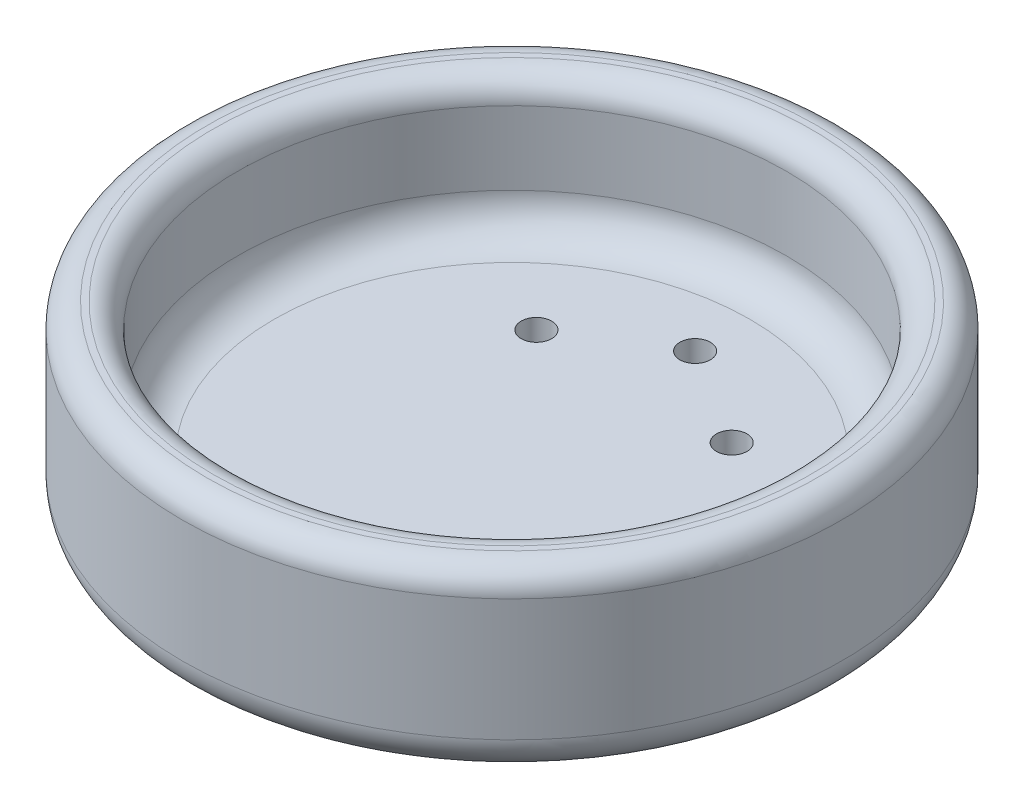
ISO-10303-21;
HEADER;
FILE_DESCRIPTION(('STEP AP214'),'2;1');
FILE_NAME('part.step','',(''),(''),'','','');
FILE_SCHEMA(('AUTOMOTIVE_DESIGN { 1 0 10303 214 1 1 1 1 }'));
ENDSEC;
DATA;
#1=APPLICATION_CONTEXT('core data for automotive mechanical design processes');
#2=APPLICATION_PROTOCOL_DEFINITION('international standard','automotive_design',2000,#1);
#3=PRODUCT_CONTEXT('',#1,'mechanical');
#4=PRODUCT('Part','Part','',(#3));
#5=PRODUCT_RELATED_PRODUCT_CATEGORY('part','',(#4));
#6=PRODUCT_DEFINITION_FORMATION('','',#4);
#7=PRODUCT_DEFINITION_CONTEXT('part definition',#1,'design');
#8=PRODUCT_DEFINITION('design','',#6,#7);
#9=PRODUCT_DEFINITION_SHAPE('','',#8);
#10=(LENGTH_UNIT() NAMED_UNIT(*) SI_UNIT(.MILLI.,.METRE.));
#11=(NAMED_UNIT(*) PLANE_ANGLE_UNIT() SI_UNIT($,.RADIAN.));
#12=(NAMED_UNIT(*) SI_UNIT($,.STERADIAN.) SOLID_ANGLE_UNIT());
#13=UNCERTAINTY_MEASURE_WITH_UNIT(LENGTH_MEASURE(1.E-05),#10,'distance_accuracy_value','');
#14=(GEOMETRIC_REPRESENTATION_CONTEXT(3) GLOBAL_UNCERTAINTY_ASSIGNED_CONTEXT((#13)) GLOBAL_UNIT_ASSIGNED_CONTEXT((#10,
#11,#12)) REPRESENTATION_CONTEXT('',''));
#15=CARTESIAN_POINT('',(0.,0.,0.));
#16=DIRECTION('',(0.,0.,1.));
#17=DIRECTION('',(1.,0.,0.));
#18=AXIS2_PLACEMENT_3D('',#15,#16,#17);
#19=CARTESIAN_POINT('',(0.,15.,0.));
#20=DIRECTION('',(0.,-1.,0.));
#21=DIRECTION('',(0.,0.,-1.));
#22=AXIS2_PLACEMENT_3D('',#19,#20,#21);
#23=CYLINDRICAL_SURFACE('',#22,27.);
#24=CARTESIAN_POINT('',(0.,13.,0.));
#25=DIRECTION('',(0.,1.,0.));
#26=DIRECTION('',(0.,0.,1.));
#27=AXIS2_PLACEMENT_3D('',#24,#25,#26);
#28=CIRCLE('',#27,27.);
#29=CARTESIAN_POINT('',(0.,13.,27.));
#30=VERTEX_POINT('',#29);
#31=EDGE_CURVE('E42',#30,#30,#28,.F.);
#32=ORIENTED_EDGE('',*,*,#31,.T.);
#33=EDGE_LOOP('',(#32));
#34=FACE_BOUND('',#33,.T.);
#35=CARTESIAN_POINT('',(0.,3.,0.));
#36=DIRECTION('',(0.,1.,0.));
#37=DIRECTION('',(0.,0.,1.));
#38=AXIS2_PLACEMENT_3D('',#35,#36,#37);
#39=CIRCLE('',#38,27.);
#40=CARTESIAN_POINT('',(0.,3.,27.));
#41=VERTEX_POINT('',#40);
#42=EDGE_CURVE('E60',#41,#41,#39,.T.);
#43=ORIENTED_EDGE('',*,*,#42,.T.);
#44=EDGE_LOOP('',(#43));
#45=FACE_BOUND('',#44,.T.);
#46=ADVANCED_FACE('F31',(#34,#45),#23,.T.);
#47=CARTESIAN_POINT('',(0.,15.,0.));
#48=DIRECTION('',(0.,1.,0.));
#49=DIRECTION('',(0.,0.,1.));
#50=AXIS2_PLACEMENT_3D('',#47,#48,#49);
#51=PLANE('',#50);
#52=CARTESIAN_POINT('',(0.,15.,0.));
#53=DIRECTION('',(0.,1.,0.));
#54=DIRECTION('',(0.,0.,1.));
#55=AXIS2_PLACEMENT_3D('',#52,#53,#54);
#56=CIRCLE('',#55,24.5);
#57=CARTESIAN_POINT('',(0.,15.,24.5));
#58=VERTEX_POINT('',#57);
#59=EDGE_CURVE('E10',#58,#58,#56,.F.);
#60=ORIENTED_EDGE('',*,*,#59,.T.);
#61=EDGE_LOOP('',(#60));
#62=FACE_BOUND('',#61,.T.);
#63=CARTESIAN_POINT('',(0.,15.,0.));
#64=DIRECTION('',(0.,1.,0.));
#65=DIRECTION('',(0.,0.,1.));
#66=AXIS2_PLACEMENT_3D('',#63,#64,#65);
#67=CIRCLE('',#66,25.);
#68=CARTESIAN_POINT('',(0.,15.,25.));
#69=VERTEX_POINT('',#68);
#70=EDGE_CURVE('E46',#69,#69,#67,.T.);
#71=ORIENTED_EDGE('',*,*,#70,.T.);
#72=EDGE_LOOP('',(#71));
#73=FACE_BOUND('',#72,.T.);
#74=ADVANCED_FACE('F111',(#62,#73),#51,.T.);
#75=CARTESIAN_POINT('',(0.,0.,0.));
#76=DIRECTION('',(0.,1.,0.));
#77=DIRECTION('',(0.,0.,1.));
#78=AXIS2_PLACEMENT_3D('',#75,#76,#77);
#79=PLANE('',#78);
#80=CARTESIAN_POINT('',(0.,0.,-15.));
#81=DIRECTION('',(0.,1.,0.));
#82=DIRECTION('',(0.,0.,1.));
#83=AXIS2_PLACEMENT_3D('',#80,#81,#82);
#84=CIRCLE('',#83,1.25);
#85=CARTESIAN_POINT('',(0.,0.,-13.75));
#86=VERTEX_POINT('',#85);
#87=EDGE_CURVE('E75',#86,#86,#84,.T.);
#88=ORIENTED_EDGE('',*,*,#87,.T.);
#89=EDGE_LOOP('',(#88));
#90=FACE_BOUND('',#89,.T.);
#91=CARTESIAN_POINT('',(8.,0.,-10.));
#92=DIRECTION('',(0.,1.,0.));
#93=DIRECTION('',(0.,0.,1.));
#94=AXIS2_PLACEMENT_3D('',#91,#92,#93);
#95=CIRCLE('',#94,1.25);
#96=CARTESIAN_POINT('',(8.,0.,-8.75));
#97=VERTEX_POINT('',#96);
#98=EDGE_CURVE('E69',#97,#97,#95,.T.);
#99=ORIENTED_EDGE('',*,*,#98,.T.);
#100=EDGE_LOOP('',(#99));
#101=FACE_BOUND('',#100,.T.);
#102=CARTESIAN_POINT('',(-8.,0.,-10.));
#103=DIRECTION('',(0.,1.,0.));
#104=DIRECTION('',(0.,0.,1.));
#105=AXIS2_PLACEMENT_3D('',#102,#103,#104);
#106=CIRCLE('',#105,1.25);
#107=CARTESIAN_POINT('',(-8.,0.,-8.75));
#108=VERTEX_POINT('',#107);
#109=EDGE_CURVE('E63',#108,#108,#106,.T.);
#110=ORIENTED_EDGE('',*,*,#109,.T.);
#111=EDGE_LOOP('',(#110));
#112=FACE_BOUND('',#111,.T.);
#113=CARTESIAN_POINT('',(0.,0.,0.));
#114=DIRECTION('',(0.,1.,0.));
#115=DIRECTION('',(0.,0.,1.));
#116=AXIS2_PLACEMENT_3D('',#113,#114,#115);
#117=CIRCLE('',#116,24.);
#118=CARTESIAN_POINT('',(0.,0.,24.));
#119=VERTEX_POINT('',#118);
#120=EDGE_CURVE('E57',#119,#119,#117,.F.);
#121=ORIENTED_EDGE('',*,*,#120,.T.);
#122=EDGE_LOOP('',(#121));
#123=FACE_BOUND('',#122,.T.);
#124=ADVANCED_FACE('F117',(#90,#101,#112,#123),#79,.F.);
#125=CARTESIAN_POINT('',(0.,4.,0.));
#126=DIRECTION('',(0.,1.,0.));
#127=DIRECTION('',(0.,0.,1.));
#128=AXIS2_PLACEMENT_3D('',#125,#126,#127);
#129=CYLINDRICAL_SURFACE('',#128,22.5);
#130=CARTESIAN_POINT('',(0.,13.,0.));
#131=DIRECTION('',(0.,1.,0.));
#132=DIRECTION('',(0.,0.,1.));
#133=AXIS2_PLACEMENT_3D('',#130,#131,#132);
#134=CIRCLE('',#133,22.5);
#135=CARTESIAN_POINT('',(0.,13.,22.5));
#136=VERTEX_POINT('',#135);
#137=EDGE_CURVE('E38',#136,#136,#134,.T.);
#138=ORIENTED_EDGE('',*,*,#137,.T.);
#139=EDGE_LOOP('',(#138));
#140=FACE_BOUND('',#139,.T.);
#141=CARTESIAN_POINT('',(0.,7.,0.));
#142=DIRECTION('',(0.,1.,0.));
#143=DIRECTION('',(0.,0.,1.));
#144=AXIS2_PLACEMENT_3D('',#141,#142,#143);
#145=CIRCLE('',#144,22.5);
#146=CARTESIAN_POINT('',(0.,7.,22.5));
#147=VERTEX_POINT('',#146);
#148=EDGE_CURVE('E51',#147,#147,#145,.F.);
#149=ORIENTED_EDGE('',*,*,#148,.T.);
#150=EDGE_LOOP('',(#149));
#151=FACE_BOUND('',#150,.T.);
#152=ADVANCED_FACE('F89',(#140,#151),#129,.F.);
#153=CARTESIAN_POINT('',(0.,4.,0.));
#154=DIRECTION('',(0.,1.,0.));
#155=DIRECTION('',(0.,0.,1.));
#156=AXIS2_PLACEMENT_3D('',#153,#154,#155);
#157=PLANE('',#156);
#158=CARTESIAN_POINT('',(0.,4.,-15.));
#159=DIRECTION('',(0.,1.,0.));
#160=DIRECTION('',(0.,0.,1.));
#161=AXIS2_PLACEMENT_3D('',#158,#159,#160);
#162=CIRCLE('',#161,1.25);
#163=CARTESIAN_POINT('',(0.,4.,-13.75));
#164=VERTEX_POINT('',#163);
#165=EDGE_CURVE('E78',#164,#164,#162,.T.);
#166=ORIENTED_EDGE('',*,*,#165,.F.);
#167=EDGE_LOOP('',(#166));
#168=FACE_BOUND('',#167,.T.);
#169=CARTESIAN_POINT('',(8.,4.,-10.));
#170=DIRECTION('',(0.,1.,0.));
#171=DIRECTION('',(0.,0.,-1.));
#172=AXIS2_PLACEMENT_3D('',#169,#170,#171);
#173=CIRCLE('',#172,1.25);
#174=CARTESIAN_POINT('',(8.,4.,-11.25));
#175=VERTEX_POINT('',#174);
#176=EDGE_CURVE('E72',#175,#175,#173,.T.);
#177=ORIENTED_EDGE('',*,*,#176,.F.);
#178=EDGE_LOOP('',(#177));
#179=FACE_BOUND('',#178,.T.);
#180=CARTESIAN_POINT('',(-8.,4.,-10.));
#181=DIRECTION('',(0.,1.,0.));
#182=DIRECTION('',(0.,0.,1.));
#183=AXIS2_PLACEMENT_3D('',#180,#181,#182);
#184=CIRCLE('',#183,1.25);
#185=CARTESIAN_POINT('',(-8.,4.,-8.75));
#186=VERTEX_POINT('',#185);
#187=EDGE_CURVE('E66',#186,#186,#184,.T.);
#188=ORIENTED_EDGE('',*,*,#187,.F.);
#189=EDGE_LOOP('',(#188));
#190=FACE_BOUND('',#189,.T.);
#191=CARTESIAN_POINT('',(0.,4.,0.));
#192=DIRECTION('',(0.,1.,0.));
#193=DIRECTION('',(0.,0.,1.));
#194=AXIS2_PLACEMENT_3D('',#191,#192,#193);
#195=CIRCLE('',#194,19.5);
#196=CARTESIAN_POINT('',(0.,4.,19.5));
#197=VERTEX_POINT('',#196);
#198=EDGE_CURVE('E54',#197,#197,#195,.T.);
#199=ORIENTED_EDGE('',*,*,#198,.T.);
#200=EDGE_LOOP('',(#199));
#201=FACE_BOUND('',#200,.T.);
#202=ADVANCED_FACE('F85',(#168,#179,#190,#201),#157,.T.);
#203=CARTESIAN_POINT('',(0.,3.,0.));
#204=DIRECTION('',(0.,1.,0.));
#205=DIRECTION('',(0.,0.,1.));
#206=AXIS2_PLACEMENT_3D('',#203,#204,#205);
#207=TOROIDAL_SURFACE('',#206,24.,3.);
#208=ORIENTED_EDGE('',*,*,#120,.F.);
#209=EDGE_LOOP('',(#208));
#210=FACE_BOUND('',#209,.T.);
#211=ORIENTED_EDGE('',*,*,#42,.F.);
#212=EDGE_LOOP('',(#211));
#213=FACE_BOUND('',#212,.T.);
#214=ADVANCED_FACE('F88',(#210,#213),#207,.T.);
#215=CARTESIAN_POINT('',(0.,7.,0.));
#216=DIRECTION('',(0.,1.,0.));
#217=DIRECTION('',(0.,0.,1.));
#218=AXIS2_PLACEMENT_3D('',#215,#216,#217);
#219=TOROIDAL_SURFACE('',#218,19.5,3.);
#220=ORIENTED_EDGE('',*,*,#148,.F.);
#221=EDGE_LOOP('',(#220));
#222=FACE_BOUND('',#221,.T.);
#223=ORIENTED_EDGE('',*,*,#198,.F.);
#224=EDGE_LOOP('',(#223));
#225=FACE_BOUND('',#224,.T.);
#226=ADVANCED_FACE('F97',(#222,#225),#219,.F.);
#227=CARTESIAN_POINT('',(0.,13.,0.));
#228=DIRECTION('',(0.,1.,0.));
#229=DIRECTION('',(0.,0.,1.));
#230=AXIS2_PLACEMENT_3D('',#227,#228,#229);
#231=TOROIDAL_SURFACE('',#230,25.,2.);
#232=ORIENTED_EDGE('',*,*,#31,.F.);
#233=EDGE_LOOP('',(#232));
#234=FACE_BOUND('',#233,.T.);
#235=ORIENTED_EDGE('',*,*,#70,.F.);
#236=EDGE_LOOP('',(#235));
#237=FACE_BOUND('',#236,.T.);
#238=ADVANCED_FACE('F99',(#234,#237),#231,.T.);
#239=CARTESIAN_POINT('',(0.,13.,0.));
#240=DIRECTION('',(0.,1.,0.));
#241=DIRECTION('',(0.,0.,1.));
#242=AXIS2_PLACEMENT_3D('',#239,#240,#241);
#243=TOROIDAL_SURFACE('',#242,24.5,2.);
#244=ORIENTED_EDGE('',*,*,#59,.F.);
#245=EDGE_LOOP('',(#244));
#246=FACE_BOUND('',#245,.T.);
#247=ORIENTED_EDGE('',*,*,#137,.F.);
#248=EDGE_LOOP('',(#247));
#249=FACE_BOUND('',#248,.T.);
#250=ADVANCED_FACE('F33',(#246,#249),#243,.T.);
#251=CARTESIAN_POINT('',(-8.,-7.,-10.));
#252=DIRECTION('',(0.,1.,0.));
#253=DIRECTION('',(0.,0.,1.));
#254=AXIS2_PLACEMENT_3D('',#251,#252,#253);
#255=CYLINDRICAL_SURFACE('',#254,1.25);
#256=ORIENTED_EDGE('',*,*,#187,.T.);
#257=EDGE_LOOP('',(#256));
#258=FACE_BOUND('',#257,.T.);
#259=ORIENTED_EDGE('',*,*,#109,.F.);
#260=EDGE_LOOP('',(#259));
#261=FACE_BOUND('',#260,.T.);
#262=ADVANCED_FACE('F126',(#258,#261),#255,.F.);
#263=CARTESIAN_POINT('',(8.,-7.,-10.));
#264=DIRECTION('',(0.,1.,0.));
#265=DIRECTION('',(0.,0.,1.));
#266=AXIS2_PLACEMENT_3D('',#263,#264,#265);
#267=CYLINDRICAL_SURFACE('',#266,1.25);
#268=ORIENTED_EDGE('',*,*,#176,.T.);
#269=EDGE_LOOP('',(#268));
#270=FACE_BOUND('',#269,.T.);
#271=ORIENTED_EDGE('',*,*,#98,.F.);
#272=EDGE_LOOP('',(#271));
#273=FACE_BOUND('',#272,.T.);
#274=ADVANCED_FACE('F129',(#270,#273),#267,.F.);
#275=CARTESIAN_POINT('',(0.,-7.,-15.));
#276=DIRECTION('',(0.,1.,0.));
#277=DIRECTION('',(0.,0.,1.));
#278=AXIS2_PLACEMENT_3D('',#275,#276,#277);
#279=CYLINDRICAL_SURFACE('',#278,1.25);
#280=ORIENTED_EDGE('',*,*,#165,.T.);
#281=EDGE_LOOP('',(#280));
#282=FACE_BOUND('',#281,.T.);
#283=ORIENTED_EDGE('',*,*,#87,.F.);
#284=EDGE_LOOP('',(#283));
#285=FACE_BOUND('',#284,.T.);
#286=ADVANCED_FACE('F82',(#282,#285),#279,.F.);
#287=CLOSED_SHELL('',(#46,#74,#124,#152,#202,#214,#226,#238,#250,#262,#274,#286));
#288=MANIFOLD_SOLID_BREP('B2',#287);
#289=ADVANCED_BREP_SHAPE_REPRESENTATION('',(#18,#288),#14);
#290=SHAPE_DEFINITION_REPRESENTATION(#9,#289);
ENDSEC;
END-ISO-10303-21;
